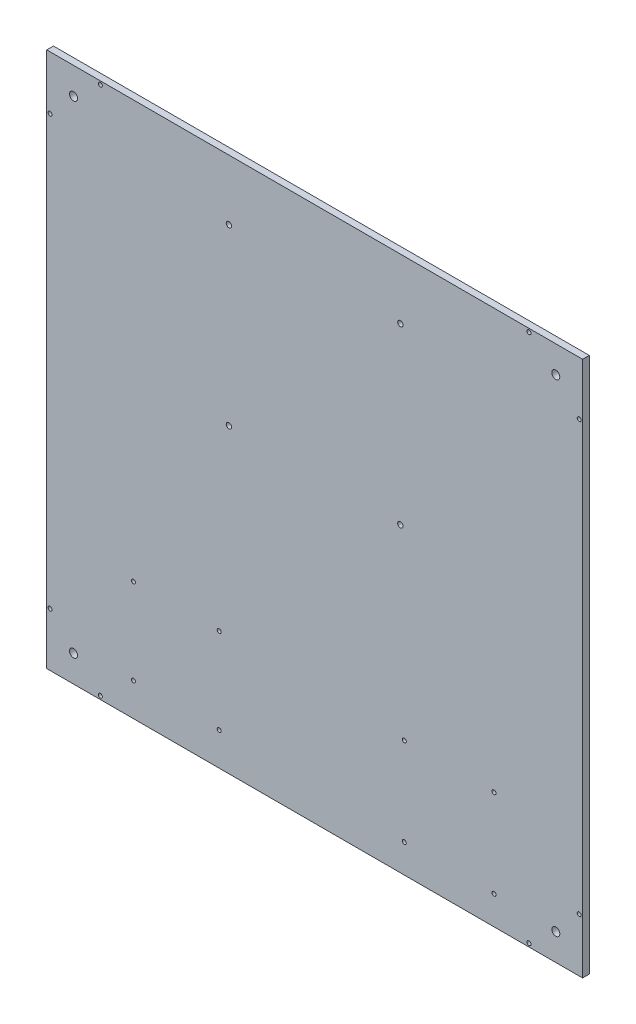
ISO-10303-21;
HEADER;
FILE_DESCRIPTION(('STEP AP214'),'2;1');
FILE_NAME('part.step','',(''),(''),'','','');
FILE_SCHEMA(('AUTOMOTIVE_DESIGN { 1 0 10303 214 1 1 1 1 }'));
ENDSEC;
DATA;
#1=APPLICATION_CONTEXT('core data for automotive mechanical design processes');
#2=APPLICATION_PROTOCOL_DEFINITION('international standard','automotive_design',2000,#1);
#3=PRODUCT_CONTEXT('',#1,'mechanical');
#4=PRODUCT('Part','Part','',(#3));
#5=PRODUCT_RELATED_PRODUCT_CATEGORY('part','',(#4));
#6=PRODUCT_DEFINITION_FORMATION('','',#4);
#7=PRODUCT_DEFINITION_CONTEXT('part definition',#1,'design');
#8=PRODUCT_DEFINITION('design','',#6,#7);
#9=PRODUCT_DEFINITION_SHAPE('','',#8);
#10=(LENGTH_UNIT() NAMED_UNIT(*) SI_UNIT(.MILLI.,.METRE.));
#11=(NAMED_UNIT(*) PLANE_ANGLE_UNIT() SI_UNIT($,.RADIAN.));
#12=(NAMED_UNIT(*) SI_UNIT($,.STERADIAN.) SOLID_ANGLE_UNIT());
#13=UNCERTAINTY_MEASURE_WITH_UNIT(LENGTH_MEASURE(1.E-05),#10,'distance_accuracy_value','');
#14=(GEOMETRIC_REPRESENTATION_CONTEXT(3) GLOBAL_UNCERTAINTY_ASSIGNED_CONTEXT((#13)) GLOBAL_UNIT_ASSIGNED_CONTEXT((#10,
#11,#12)) REPRESENTATION_CONTEXT('',''));
#15=CARTESIAN_POINT('',(0.,0.,0.));
#16=DIRECTION('',(0.,0.,1.));
#17=DIRECTION('',(1.,0.,0.));
#18=AXIS2_PLACEMENT_3D('',#15,#16,#17);
#19=CARTESIAN_POINT('',(0.,0.,5.));
#20=DIRECTION('',(0.,1.,0.));
#21=DIRECTION('',(0.,0.,1.));
#22=AXIS2_PLACEMENT_3D('',#19,#20,#21);
#23=PLANE('',#22);
#24=DIRECTION('',(1.,0.,0.));
#25=VECTOR('',#24,1.);
#26=CARTESIAN_POINT('',(0.,0.,0.));
#27=LINE('',#26,#25);
#28=CARTESIAN_POINT('',(0.,0.,0.));
#29=VERTEX_POINT('',#28);
#30=CARTESIAN_POINT('',(400.,0.,0.));
#31=VERTEX_POINT('',#30);
#32=EDGE_CURVE('E176',#29,#31,#27,.T.);
#33=ORIENTED_EDGE('',*,*,#32,.T.);
#34=DIRECTION('',(0.,0.,-1.));
#35=VECTOR('',#34,1.);
#36=CARTESIAN_POINT('',(400.,0.,5.));
#37=LINE('',#36,#35);
#38=CARTESIAN_POINT('',(400.,0.,5.));
#39=VERTEX_POINT('',#38);
#40=EDGE_CURVE('E11',#39,#31,#37,.T.);
#41=ORIENTED_EDGE('',*,*,#40,.F.);
#42=DIRECTION('',(1.,0.,0.));
#43=VECTOR('',#42,1.);
#44=CARTESIAN_POINT('',(0.,0.,5.));
#45=LINE('',#44,#43);
#46=CARTESIAN_POINT('',(0.,0.,5.));
#47=VERTEX_POINT('',#46);
#48=EDGE_CURVE('E90',#47,#39,#45,.T.);
#49=ORIENTED_EDGE('',*,*,#48,.F.);
#50=DIRECTION('',(0.,0.,-1.));
#51=VECTOR('',#50,1.);
#52=CARTESIAN_POINT('',(0.,0.,5.));
#53=LINE('',#52,#51);
#54=EDGE_CURVE('E56',#47,#29,#53,.T.);
#55=ORIENTED_EDGE('',*,*,#54,.T.);
#56=EDGE_LOOP('',(#33,#41,#49,#55));
#57=FACE_BOUND('',#56,.T.);
#58=ADVANCED_FACE('F39',(#57),#23,.F.);
#59=CARTESIAN_POINT('',(400.,0.,5.));
#60=DIRECTION('',(-1.,0.,0.));
#61=DIRECTION('',(0.,0.,1.));
#62=AXIS2_PLACEMENT_3D('',#59,#60,#61);
#63=PLANE('',#62);
#64=DIRECTION('',(0.,1.,0.));
#65=VECTOR('',#64,1.);
#66=CARTESIAN_POINT('',(400.,0.,0.));
#67=LINE('',#66,#65);
#68=CARTESIAN_POINT('',(400.,400.,0.));
#69=VERTEX_POINT('',#68);
#70=EDGE_CURVE('E95',#31,#69,#67,.T.);
#71=ORIENTED_EDGE('',*,*,#70,.T.);
#72=DIRECTION('',(0.,0.,-1.));
#73=VECTOR('',#72,1.);
#74=CARTESIAN_POINT('',(400.,400.,5.));
#75=LINE('',#74,#73);
#76=CARTESIAN_POINT('',(400.,400.,5.));
#77=VERTEX_POINT('',#76);
#78=EDGE_CURVE('E48',#77,#69,#75,.T.);
#79=ORIENTED_EDGE('',*,*,#78,.F.);
#80=DIRECTION('',(0.,1.,0.));
#81=VECTOR('',#80,1.);
#82=CARTESIAN_POINT('',(400.,0.,5.));
#83=LINE('',#82,#81);
#84=EDGE_CURVE('E81',#39,#77,#83,.T.);
#85=ORIENTED_EDGE('',*,*,#84,.F.);
#86=ORIENTED_EDGE('',*,*,#40,.T.);
#87=EDGE_LOOP('',(#71,#79,#85,#86));
#88=FACE_BOUND('',#87,.T.);
#89=ADVANCED_FACE('F94',(#88),#63,.F.);
#90=CARTESIAN_POINT('',(0.,400.,5.));
#91=DIRECTION('',(0.,1.,0.));
#92=DIRECTION('',(0.,0.,1.));
#93=AXIS2_PLACEMENT_3D('',#90,#91,#92);
#94=PLANE('',#93);
#95=DIRECTION('',(1.,0.,0.));
#96=VECTOR('',#95,1.);
#97=CARTESIAN_POINT('',(0.,400.,0.));
#98=LINE('',#97,#96);
#99=CARTESIAN_POINT('',(0.,400.,0.));
#100=VERTEX_POINT('',#99);
#101=EDGE_CURVE('E179',#100,#69,#98,.T.);
#102=ORIENTED_EDGE('',*,*,#101,.F.);
#103=DIRECTION('',(0.,0.,-1.));
#104=VECTOR('',#103,1.);
#105=CARTESIAN_POINT('',(0.,400.,5.));
#106=LINE('',#105,#104);
#107=CARTESIAN_POINT('',(0.,400.,5.));
#108=VERTEX_POINT('',#107);
#109=EDGE_CURVE('E70',#108,#100,#106,.T.);
#110=ORIENTED_EDGE('',*,*,#109,.F.);
#111=DIRECTION('',(1.,0.,0.));
#112=VECTOR('',#111,1.);
#113=CARTESIAN_POINT('',(0.,400.,5.));
#114=LINE('',#113,#112);
#115=EDGE_CURVE('E89',#108,#77,#114,.T.);
#116=ORIENTED_EDGE('',*,*,#115,.T.);
#117=ORIENTED_EDGE('',*,*,#78,.T.);
#118=EDGE_LOOP('',(#102,#110,#116,#117));
#119=FACE_BOUND('',#118,.T.);
#120=ADVANCED_FACE('F98',(#119),#94,.T.);
#121=CARTESIAN_POINT('',(136.,225.,5.));
#122=DIRECTION('',(0.,0.,-1.));
#123=DIRECTION('',(-1.,0.,0.));
#124=AXIS2_PLACEMENT_3D('',#121,#122,#123);
#125=CYLINDRICAL_SURFACE('',#124,2.);
#126=CARTESIAN_POINT('',(136.,225.,5.));
#127=DIRECTION('',(0.,0.,1.));
#128=DIRECTION('',(1.,0.,0.));
#129=AXIS2_PLACEMENT_3D('',#126,#127,#128);
#130=CIRCLE('',#129,2.);
#131=CARTESIAN_POINT('',(138.,225.,5.));
#132=VERTEX_POINT('',#131);
#133=EDGE_CURVE('E110',#132,#132,#130,.T.);
#134=ORIENTED_EDGE('',*,*,#133,.T.);
#135=EDGE_LOOP('',(#134));
#136=FACE_BOUND('',#135,.T.);
#137=CARTESIAN_POINT('',(136.,225.,0.));
#138=DIRECTION('',(0.,0.,1.));
#139=DIRECTION('',(1.,0.,0.));
#140=AXIS2_PLACEMENT_3D('',#137,#138,#139);
#141=CIRCLE('',#140,2.);
#142=CARTESIAN_POINT('',(138.,225.,0.));
#143=VERTEX_POINT('',#142);
#144=EDGE_CURVE('E190',#143,#143,#141,.T.);
#145=ORIENTED_EDGE('',*,*,#144,.F.);
#146=EDGE_LOOP('',(#145));
#147=FACE_BOUND('',#146,.T.);
#148=ADVANCED_FACE('F412',(#136,#147),#125,.F.);
#149=CARTESIAN_POINT('',(264.,225.,5.));
#150=DIRECTION('',(0.,0.,-1.));
#151=DIRECTION('',(-1.,0.,0.));
#152=AXIS2_PLACEMENT_3D('',#149,#150,#151);
#153=CYLINDRICAL_SURFACE('',#152,2.);
#154=CARTESIAN_POINT('',(264.,225.,5.));
#155=DIRECTION('',(0.,0.,1.));
#156=DIRECTION('',(1.,0.,0.));
#157=AXIS2_PLACEMENT_3D('',#154,#155,#156);
#158=CIRCLE('',#157,2.);
#159=CARTESIAN_POINT('',(266.,225.,5.));
#160=VERTEX_POINT('',#159);
#161=EDGE_CURVE('E107',#160,#160,#158,.T.);
#162=ORIENTED_EDGE('',*,*,#161,.T.);
#163=EDGE_LOOP('',(#162));
#164=FACE_BOUND('',#163,.T.);
#165=CARTESIAN_POINT('',(264.,225.,0.));
#166=DIRECTION('',(0.,0.,1.));
#167=DIRECTION('',(1.,0.,0.));
#168=AXIS2_PLACEMENT_3D('',#165,#166,#167);
#169=CIRCLE('',#168,2.);
#170=CARTESIAN_POINT('',(266.,225.,0.));
#171=VERTEX_POINT('',#170);
#172=EDGE_CURVE('E187',#171,#171,#169,.T.);
#173=ORIENTED_EDGE('',*,*,#172,.F.);
#174=EDGE_LOOP('',(#173));
#175=FACE_BOUND('',#174,.T.);
#176=ADVANCED_FACE('F414',(#164,#175),#153,.F.);
#177=CARTESIAN_POINT('',(264.,355.,5.));
#178=DIRECTION('',(0.,0.,-1.));
#179=DIRECTION('',(-1.,0.,0.));
#180=AXIS2_PLACEMENT_3D('',#177,#178,#179);
#181=CYLINDRICAL_SURFACE('',#180,2.);
#182=CARTESIAN_POINT('',(264.,355.,5.));
#183=DIRECTION('',(0.,0.,1.));
#184=DIRECTION('',(1.,0.,0.));
#185=AXIS2_PLACEMENT_3D('',#182,#183,#184);
#186=CIRCLE('',#185,2.);
#187=CARTESIAN_POINT('',(266.,355.,5.));
#188=VERTEX_POINT('',#187);
#189=EDGE_CURVE('E101',#188,#188,#186,.T.);
#190=ORIENTED_EDGE('',*,*,#189,.T.);
#191=EDGE_LOOP('',(#190));
#192=FACE_BOUND('',#191,.T.);
#193=CARTESIAN_POINT('',(264.,355.,0.));
#194=DIRECTION('',(0.,0.,1.));
#195=DIRECTION('',(1.,0.,0.));
#196=AXIS2_PLACEMENT_3D('',#193,#194,#195);
#197=CIRCLE('',#196,2.);
#198=CARTESIAN_POINT('',(266.,355.,0.));
#199=VERTEX_POINT('',#198);
#200=EDGE_CURVE('E184',#199,#199,#197,.T.);
#201=ORIENTED_EDGE('',*,*,#200,.F.);
#202=EDGE_LOOP('',(#201));
#203=FACE_BOUND('',#202,.T.);
#204=ADVANCED_FACE('F421',(#192,#203),#181,.F.);
#205=CARTESIAN_POINT('',(0.,0.,5.));
#206=DIRECTION('',(-1.,0.,0.));
#207=DIRECTION('',(0.,0.,1.));
#208=AXIS2_PLACEMENT_3D('',#205,#206,#207);
#209=PLANE('',#208);
#210=DIRECTION('',(0.,1.,0.));
#211=VECTOR('',#210,1.);
#212=CARTESIAN_POINT('',(0.,0.,0.));
#213=LINE('',#212,#211);
#214=EDGE_CURVE('E181',#29,#100,#213,.T.);
#215=ORIENTED_EDGE('',*,*,#214,.F.);
#216=ORIENTED_EDGE('',*,*,#54,.F.);
#217=DIRECTION('',(0.,1.,0.));
#218=VECTOR('',#217,1.);
#219=CARTESIAN_POINT('',(0.,0.,5.));
#220=LINE('',#219,#218);
#221=EDGE_CURVE('E99',#47,#108,#220,.T.);
#222=ORIENTED_EDGE('',*,*,#221,.T.);
#223=ORIENTED_EDGE('',*,*,#109,.T.);
#224=EDGE_LOOP('',(#215,#216,#222,#223));
#225=FACE_BOUND('',#224,.T.);
#226=ADVANCED_FACE('F291',(#225),#209,.T.);
#227=CARTESIAN_POINT('',(20.,380.,5.));
#228=DIRECTION('',(0.,0.,-1.));
#229=DIRECTION('',(-1.,0.,0.));
#230=AXIS2_PLACEMENT_3D('',#227,#228,#229);
#231=CYLINDRICAL_SURFACE('',#230,3.);
#232=CARTESIAN_POINT('',(20.,380.,5.));
#233=DIRECTION('',(0.,0.,1.));
#234=DIRECTION('',(1.,0.,0.));
#235=AXIS2_PLACEMENT_3D('',#232,#233,#234);
#236=CIRCLE('',#235,3.);
#237=CARTESIAN_POINT('',(23.,380.,5.));
#238=VERTEX_POINT('',#237);
#239=EDGE_CURVE('E259',#238,#238,#236,.T.);
#240=ORIENTED_EDGE('',*,*,#239,.T.);
#241=EDGE_LOOP('',(#240));
#242=FACE_BOUND('',#241,.T.);
#243=CARTESIAN_POINT('',(20.,380.,0.));
#244=DIRECTION('',(0.,0.,1.));
#245=DIRECTION('',(1.,0.,0.));
#246=AXIS2_PLACEMENT_3D('',#243,#244,#245);
#247=CIRCLE('',#246,3.);
#248=CARTESIAN_POINT('',(23.,380.,0.));
#249=VERTEX_POINT('',#248);
#250=EDGE_CURVE('E173',#249,#249,#247,.T.);
#251=ORIENTED_EDGE('',*,*,#250,.F.);
#252=EDGE_LOOP('',(#251));
#253=FACE_BOUND('',#252,.T.);
#254=ADVANCED_FACE('F263',(#242,#253),#231,.F.);
#255=CARTESIAN_POINT('',(20.,20.,5.));
#256=DIRECTION('',(0.,0.,-1.));
#257=DIRECTION('',(-1.,0.,0.));
#258=AXIS2_PLACEMENT_3D('',#255,#256,#257);
#259=CYLINDRICAL_SURFACE('',#258,3.);
#260=CARTESIAN_POINT('',(20.,20.,5.));
#261=DIRECTION('',(0.,0.,1.));
#262=DIRECTION('',(1.,0.,0.));
#263=AXIS2_PLACEMENT_3D('',#260,#261,#262);
#264=CIRCLE('',#263,3.);
#265=CARTESIAN_POINT('',(23.,20.,5.));
#266=VERTEX_POINT('',#265);
#267=EDGE_CURVE('E256',#266,#266,#264,.T.);
#268=ORIENTED_EDGE('',*,*,#267,.T.);
#269=EDGE_LOOP('',(#268));
#270=FACE_BOUND('',#269,.T.);
#271=CARTESIAN_POINT('',(20.,20.,0.));
#272=DIRECTION('',(0.,0.,1.));
#273=DIRECTION('',(1.,0.,0.));
#274=AXIS2_PLACEMENT_3D('',#271,#272,#273);
#275=CIRCLE('',#274,3.);
#276=CARTESIAN_POINT('',(23.,20.,0.));
#277=VERTEX_POINT('',#276);
#278=EDGE_CURVE('E170',#277,#277,#275,.T.);
#279=ORIENTED_EDGE('',*,*,#278,.F.);
#280=EDGE_LOOP('',(#279));
#281=FACE_BOUND('',#280,.T.);
#282=ADVANCED_FACE('F290',(#270,#281),#259,.F.);
#283=CARTESIAN_POINT('',(380.,20.,5.));
#284=DIRECTION('',(0.,0.,-1.));
#285=DIRECTION('',(-1.,0.,0.));
#286=AXIS2_PLACEMENT_3D('',#283,#284,#285);
#287=CYLINDRICAL_SURFACE('',#286,2.99999999999999);
#288=CARTESIAN_POINT('',(380.,20.,5.));
#289=DIRECTION('',(0.,0.,1.));
#290=DIRECTION('',(1.,0.,0.));
#291=AXIS2_PLACEMENT_3D('',#288,#289,#290);
#292=CIRCLE('',#291,2.99999999999999);
#293=CARTESIAN_POINT('',(383.,20.,5.));
#294=VERTEX_POINT('',#293);
#295=EDGE_CURVE('E253',#294,#294,#292,.T.);
#296=ORIENTED_EDGE('',*,*,#295,.T.);
#297=EDGE_LOOP('',(#296));
#298=FACE_BOUND('',#297,.T.);
#299=CARTESIAN_POINT('',(380.,20.,0.));
#300=DIRECTION('',(0.,0.,1.));
#301=DIRECTION('',(1.,0.,0.));
#302=AXIS2_PLACEMENT_3D('',#299,#300,#301);
#303=CIRCLE('',#302,2.99999999999999);
#304=CARTESIAN_POINT('',(383.,20.,0.));
#305=VERTEX_POINT('',#304);
#306=EDGE_CURVE('E167',#305,#305,#303,.T.);
#307=ORIENTED_EDGE('',*,*,#306,.F.);
#308=EDGE_LOOP('',(#307));
#309=FACE_BOUND('',#308,.T.);
#310=ADVANCED_FACE('F294',(#298,#309),#287,.F.);
#311=CARTESIAN_POINT('',(380.,380.,5.));
#312=DIRECTION('',(0.,0.,-1.));
#313=DIRECTION('',(-1.,0.,0.));
#314=AXIS2_PLACEMENT_3D('',#311,#312,#313);
#315=CYLINDRICAL_SURFACE('',#314,2.99999999999999);
#316=CARTESIAN_POINT('',(380.,380.,5.));
#317=DIRECTION('',(0.,0.,1.));
#318=DIRECTION('',(1.,0.,0.));
#319=AXIS2_PLACEMENT_3D('',#316,#317,#318);
#320=CIRCLE('',#319,2.99999999999999);
#321=CARTESIAN_POINT('',(383.,380.,5.));
#322=VERTEX_POINT('',#321);
#323=EDGE_CURVE('E250',#322,#322,#320,.T.);
#324=ORIENTED_EDGE('',*,*,#323,.T.);
#325=EDGE_LOOP('',(#324));
#326=FACE_BOUND('',#325,.T.);
#327=CARTESIAN_POINT('',(380.,380.,0.));
#328=DIRECTION('',(0.,0.,1.));
#329=DIRECTION('',(1.,0.,0.));
#330=AXIS2_PLACEMENT_3D('',#327,#328,#329);
#331=CIRCLE('',#330,2.99999999999999);
#332=CARTESIAN_POINT('',(383.,380.,0.));
#333=VERTEX_POINT('',#332);
#334=EDGE_CURVE('E164',#333,#333,#331,.T.);
#335=ORIENTED_EDGE('',*,*,#334,.F.);
#336=EDGE_LOOP('',(#335));
#337=FACE_BOUND('',#336,.T.);
#338=ADVANCED_FACE('F298',(#326,#337),#315,.F.);
#339=CARTESIAN_POINT('',(40.,2.5,5.));
#340=DIRECTION('',(0.,0.,-1.));
#341=DIRECTION('',(-1.,0.,0.));
#342=AXIS2_PLACEMENT_3D('',#339,#340,#341);
#343=CYLINDRICAL_SURFACE('',#342,1.5);
#344=CARTESIAN_POINT('',(40.,2.5,5.));
#345=DIRECTION('',(0.,0.,1.));
#346=DIRECTION('',(1.,0.,0.));
#347=AXIS2_PLACEMENT_3D('',#344,#345,#346);
#348=CIRCLE('',#347,1.5);
#349=CARTESIAN_POINT('',(41.5,2.5,5.));
#350=VERTEX_POINT('',#349);
#351=EDGE_CURVE('E247',#350,#350,#348,.T.);
#352=ORIENTED_EDGE('',*,*,#351,.T.);
#353=EDGE_LOOP('',(#352));
#354=FACE_BOUND('',#353,.T.);
#355=CARTESIAN_POINT('',(40.,2.5,0.));
#356=DIRECTION('',(0.,0.,1.));
#357=DIRECTION('',(1.,0.,0.));
#358=AXIS2_PLACEMENT_3D('',#355,#356,#357);
#359=CIRCLE('',#358,1.5);
#360=CARTESIAN_POINT('',(41.5,2.5,0.));
#361=VERTEX_POINT('',#360);
#362=EDGE_CURVE('E161',#361,#361,#359,.T.);
#363=ORIENTED_EDGE('',*,*,#362,.F.);
#364=EDGE_LOOP('',(#363));
#365=FACE_BOUND('',#364,.T.);
#366=ADVANCED_FACE('F302',(#354,#365),#343,.F.);
#367=CARTESIAN_POINT('',(2.5,40.,5.));
#368=DIRECTION('',(0.,0.,-1.));
#369=DIRECTION('',(-1.,0.,0.));
#370=AXIS2_PLACEMENT_3D('',#367,#368,#369);
#371=CYLINDRICAL_SURFACE('',#370,1.5);
#372=CARTESIAN_POINT('',(2.5,40.,5.));
#373=DIRECTION('',(0.,0.,1.));
#374=DIRECTION('',(1.,0.,0.));
#375=AXIS2_PLACEMENT_3D('',#372,#373,#374);
#376=CIRCLE('',#375,1.5);
#377=CARTESIAN_POINT('',(4.,40.,5.));
#378=VERTEX_POINT('',#377);
#379=EDGE_CURVE('E244',#378,#378,#376,.T.);
#380=ORIENTED_EDGE('',*,*,#379,.T.);
#381=EDGE_LOOP('',(#380));
#382=FACE_BOUND('',#381,.T.);
#383=CARTESIAN_POINT('',(2.5,40.,0.));
#384=DIRECTION('',(0.,0.,1.));
#385=DIRECTION('',(1.,0.,0.));
#386=AXIS2_PLACEMENT_3D('',#383,#384,#385);
#387=CIRCLE('',#386,1.5);
#388=CARTESIAN_POINT('',(4.,40.,0.));
#389=VERTEX_POINT('',#388);
#390=EDGE_CURVE('E158',#389,#389,#387,.T.);
#391=ORIENTED_EDGE('',*,*,#390,.F.);
#392=EDGE_LOOP('',(#391));
#393=FACE_BOUND('',#392,.T.);
#394=ADVANCED_FACE('F306',(#382,#393),#371,.F.);
#395=CARTESIAN_POINT('',(2.5,360.,5.));
#396=DIRECTION('',(0.,0.,-1.));
#397=DIRECTION('',(-1.,0.,0.));
#398=AXIS2_PLACEMENT_3D('',#395,#396,#397);
#399=CYLINDRICAL_SURFACE('',#398,1.5);
#400=CARTESIAN_POINT('',(2.5,360.,5.));
#401=DIRECTION('',(0.,0.,1.));
#402=DIRECTION('',(1.,0.,0.));
#403=AXIS2_PLACEMENT_3D('',#400,#401,#402);
#404=CIRCLE('',#403,1.5);
#405=CARTESIAN_POINT('',(4.,360.,5.));
#406=VERTEX_POINT('',#405);
#407=EDGE_CURVE('E241',#406,#406,#404,.T.);
#408=ORIENTED_EDGE('',*,*,#407,.T.);
#409=EDGE_LOOP('',(#408));
#410=FACE_BOUND('',#409,.T.);
#411=CARTESIAN_POINT('',(2.5,360.,0.));
#412=DIRECTION('',(0.,0.,1.));
#413=DIRECTION('',(1.,0.,0.));
#414=AXIS2_PLACEMENT_3D('',#411,#412,#413);
#415=CIRCLE('',#414,1.5);
#416=CARTESIAN_POINT('',(4.,360.,0.));
#417=VERTEX_POINT('',#416);
#418=EDGE_CURVE('E155',#417,#417,#415,.T.);
#419=ORIENTED_EDGE('',*,*,#418,.F.);
#420=EDGE_LOOP('',(#419));
#421=FACE_BOUND('',#420,.T.);
#422=ADVANCED_FACE('F310',(#410,#421),#399,.F.);
#423=CARTESIAN_POINT('',(397.5,360.,5.));
#424=DIRECTION('',(0.,0.,-1.));
#425=DIRECTION('',(-1.,0.,0.));
#426=AXIS2_PLACEMENT_3D('',#423,#424,#425);
#427=CYLINDRICAL_SURFACE('',#426,1.50000000000002);
#428=CARTESIAN_POINT('',(397.5,360.,5.));
#429=DIRECTION('',(0.,0.,1.));
#430=DIRECTION('',(1.,0.,0.));
#431=AXIS2_PLACEMENT_3D('',#428,#429,#430);
#432=CIRCLE('',#431,1.50000000000002);
#433=CARTESIAN_POINT('',(399.,360.,5.));
#434=VERTEX_POINT('',#433);
#435=EDGE_CURVE('E238',#434,#434,#432,.T.);
#436=ORIENTED_EDGE('',*,*,#435,.T.);
#437=EDGE_LOOP('',(#436));
#438=FACE_BOUND('',#437,.T.);
#439=CARTESIAN_POINT('',(397.5,360.,0.));
#440=DIRECTION('',(0.,0.,1.));
#441=DIRECTION('',(1.,0.,0.));
#442=AXIS2_PLACEMENT_3D('',#439,#440,#441);
#443=CIRCLE('',#442,1.50000000000002);
#444=CARTESIAN_POINT('',(399.,360.,0.));
#445=VERTEX_POINT('',#444);
#446=EDGE_CURVE('E152',#445,#445,#443,.T.);
#447=ORIENTED_EDGE('',*,*,#446,.F.);
#448=EDGE_LOOP('',(#447));
#449=FACE_BOUND('',#448,.T.);
#450=ADVANCED_FACE('F314',(#438,#449),#427,.F.);
#451=CARTESIAN_POINT('',(360.,2.5,5.));
#452=DIRECTION('',(0.,0.,-1.));
#453=DIRECTION('',(-1.,0.,0.));
#454=AXIS2_PLACEMENT_3D('',#451,#452,#453);
#455=CYLINDRICAL_SURFACE('',#454,1.50000000000002);
#456=CARTESIAN_POINT('',(360.,2.5,5.));
#457=DIRECTION('',(0.,0.,1.));
#458=DIRECTION('',(1.,0.,0.));
#459=AXIS2_PLACEMENT_3D('',#456,#457,#458);
#460=CIRCLE('',#459,1.50000000000002);
#461=CARTESIAN_POINT('',(361.5,2.5,5.));
#462=VERTEX_POINT('',#461);
#463=EDGE_CURVE('E235',#462,#462,#460,.T.);
#464=ORIENTED_EDGE('',*,*,#463,.T.);
#465=EDGE_LOOP('',(#464));
#466=FACE_BOUND('',#465,.T.);
#467=CARTESIAN_POINT('',(360.,2.5,0.));
#468=DIRECTION('',(0.,0.,1.));
#469=DIRECTION('',(1.,0.,0.));
#470=AXIS2_PLACEMENT_3D('',#467,#468,#469);
#471=CIRCLE('',#470,1.50000000000002);
#472=CARTESIAN_POINT('',(361.5,2.5,0.));
#473=VERTEX_POINT('',#472);
#474=EDGE_CURVE('E149',#473,#473,#471,.T.);
#475=ORIENTED_EDGE('',*,*,#474,.F.);
#476=EDGE_LOOP('',(#475));
#477=FACE_BOUND('',#476,.T.);
#478=ADVANCED_FACE('F318',(#466,#477),#455,.F.);
#479=CARTESIAN_POINT('',(40.,397.5,5.));
#480=DIRECTION('',(0.,0.,-1.));
#481=DIRECTION('',(-1.,0.,0.));
#482=AXIS2_PLACEMENT_3D('',#479,#480,#481);
#483=CYLINDRICAL_SURFACE('',#482,1.5);
#484=CARTESIAN_POINT('',(40.,397.5,5.));
#485=DIRECTION('',(0.,0.,1.));
#486=DIRECTION('',(1.,0.,0.));
#487=AXIS2_PLACEMENT_3D('',#484,#485,#486);
#488=CIRCLE('',#487,1.5);
#489=CARTESIAN_POINT('',(41.5,397.5,5.));
#490=VERTEX_POINT('',#489);
#491=EDGE_CURVE('E232',#490,#490,#488,.T.);
#492=ORIENTED_EDGE('',*,*,#491,.T.);
#493=EDGE_LOOP('',(#492));
#494=FACE_BOUND('',#493,.T.);
#495=CARTESIAN_POINT('',(40.,397.5,0.));
#496=DIRECTION('',(0.,0.,1.));
#497=DIRECTION('',(1.,0.,0.));
#498=AXIS2_PLACEMENT_3D('',#495,#496,#497);
#499=CIRCLE('',#498,1.5);
#500=CARTESIAN_POINT('',(41.5,397.5,0.));
#501=VERTEX_POINT('',#500);
#502=EDGE_CURVE('E146',#501,#501,#499,.T.);
#503=ORIENTED_EDGE('',*,*,#502,.F.);
#504=EDGE_LOOP('',(#503));
#505=FACE_BOUND('',#504,.T.);
#506=ADVANCED_FACE('F322',(#494,#505),#483,.F.);
#507=CARTESIAN_POINT('',(360.,397.5,5.));
#508=DIRECTION('',(0.,0.,-1.));
#509=DIRECTION('',(-1.,0.,0.));
#510=AXIS2_PLACEMENT_3D('',#507,#508,#509);
#511=CYLINDRICAL_SURFACE('',#510,1.50000000000002);
#512=CARTESIAN_POINT('',(360.,397.5,5.));
#513=DIRECTION('',(0.,0.,1.));
#514=DIRECTION('',(1.,0.,0.));
#515=AXIS2_PLACEMENT_3D('',#512,#513,#514);
#516=CIRCLE('',#515,1.50000000000002);
#517=CARTESIAN_POINT('',(361.5,397.5,5.));
#518=VERTEX_POINT('',#517);
#519=EDGE_CURVE('E229',#518,#518,#516,.T.);
#520=ORIENTED_EDGE('',*,*,#519,.T.);
#521=EDGE_LOOP('',(#520));
#522=FACE_BOUND('',#521,.T.);
#523=CARTESIAN_POINT('',(360.,397.5,0.));
#524=DIRECTION('',(0.,0.,1.));
#525=DIRECTION('',(1.,0.,0.));
#526=AXIS2_PLACEMENT_3D('',#523,#524,#525);
#527=CIRCLE('',#526,1.50000000000002);
#528=CARTESIAN_POINT('',(361.5,397.5,0.));
#529=VERTEX_POINT('',#528);
#530=EDGE_CURVE('E143',#529,#529,#527,.T.);
#531=ORIENTED_EDGE('',*,*,#530,.F.);
#532=EDGE_LOOP('',(#531));
#533=FACE_BOUND('',#532,.T.);
#534=ADVANCED_FACE('F326',(#522,#533),#511,.F.);
#535=CARTESIAN_POINT('',(397.5,40.,5.));
#536=DIRECTION('',(0.,0.,-1.));
#537=DIRECTION('',(-1.,0.,0.));
#538=AXIS2_PLACEMENT_3D('',#535,#536,#537);
#539=CYLINDRICAL_SURFACE('',#538,1.50000000000002);
#540=CARTESIAN_POINT('',(397.5,40.,5.));
#541=DIRECTION('',(0.,0.,1.));
#542=DIRECTION('',(1.,0.,0.));
#543=AXIS2_PLACEMENT_3D('',#540,#541,#542);
#544=CIRCLE('',#543,1.50000000000002);
#545=CARTESIAN_POINT('',(399.,40.,5.));
#546=VERTEX_POINT('',#545);
#547=EDGE_CURVE('E226',#546,#546,#544,.T.);
#548=ORIENTED_EDGE('',*,*,#547,.T.);
#549=EDGE_LOOP('',(#548));
#550=FACE_BOUND('',#549,.T.);
#551=CARTESIAN_POINT('',(397.5,40.,0.));
#552=DIRECTION('',(0.,0.,1.));
#553=DIRECTION('',(1.,0.,0.));
#554=AXIS2_PLACEMENT_3D('',#551,#552,#553);
#555=CIRCLE('',#554,1.50000000000002);
#556=CARTESIAN_POINT('',(399.,40.,0.));
#557=VERTEX_POINT('',#556);
#558=EDGE_CURVE('E140',#557,#557,#555,.T.);
#559=ORIENTED_EDGE('',*,*,#558,.F.);
#560=EDGE_LOOP('',(#559));
#561=FACE_BOUND('',#560,.T.);
#562=ADVANCED_FACE('F330',(#550,#561),#539,.F.);
#563=CARTESIAN_POINT('',(333.89,21.385,5.));
#564=DIRECTION('',(0.,0.,-1.));
#565=DIRECTION('',(-1.,0.,0.));
#566=AXIS2_PLACEMENT_3D('',#563,#564,#565);
#567=CYLINDRICAL_SURFACE('',#566,1.50000000000002);
#568=CARTESIAN_POINT('',(333.89,21.385,5.));
#569=DIRECTION('',(0.,0.,1.));
#570=DIRECTION('',(1.,0.,0.));
#571=AXIS2_PLACEMENT_3D('',#568,#569,#570);
#572=CIRCLE('',#571,1.50000000000002);
#573=CARTESIAN_POINT('',(335.39,21.385,5.));
#574=VERTEX_POINT('',#573);
#575=EDGE_CURVE('E223',#574,#574,#572,.T.);
#576=ORIENTED_EDGE('',*,*,#575,.T.);
#577=EDGE_LOOP('',(#576));
#578=FACE_BOUND('',#577,.T.);
#579=CARTESIAN_POINT('',(333.89,21.385,0.));
#580=DIRECTION('',(0.,0.,1.));
#581=DIRECTION('',(1.,0.,0.));
#582=AXIS2_PLACEMENT_3D('',#579,#580,#581);
#583=CIRCLE('',#582,1.50000000000002);
#584=CARTESIAN_POINT('',(335.39,21.385,0.));
#585=VERTEX_POINT('',#584);
#586=EDGE_CURVE('E137',#585,#585,#583,.T.);
#587=ORIENTED_EDGE('',*,*,#586,.F.);
#588=EDGE_LOOP('',(#587));
#589=FACE_BOUND('',#588,.T.);
#590=ADVANCED_FACE('F334',(#578,#589),#567,.F.);
#591=CARTESIAN_POINT('',(266.89,21.385,5.));
#592=DIRECTION('',(0.,0.,-1.));
#593=DIRECTION('',(-1.,0.,0.));
#594=AXIS2_PLACEMENT_3D('',#591,#592,#593);
#595=CYLINDRICAL_SURFACE('',#594,1.50000000000002);
#596=CARTESIAN_POINT('',(266.89,21.385,5.));
#597=DIRECTION('',(0.,0.,1.));
#598=DIRECTION('',(1.,0.,0.));
#599=AXIS2_PLACEMENT_3D('',#596,#597,#598);
#600=CIRCLE('',#599,1.50000000000002);
#601=CARTESIAN_POINT('',(268.39,21.385,5.));
#602=VERTEX_POINT('',#601);
#603=EDGE_CURVE('E220',#602,#602,#600,.T.);
#604=ORIENTED_EDGE('',*,*,#603,.T.);
#605=EDGE_LOOP('',(#604));
#606=FACE_BOUND('',#605,.T.);
#607=CARTESIAN_POINT('',(266.89,21.385,0.));
#608=DIRECTION('',(0.,0.,1.));
#609=DIRECTION('',(1.,0.,0.));
#610=AXIS2_PLACEMENT_3D('',#607,#608,#609);
#611=CIRCLE('',#610,1.50000000000002);
#612=CARTESIAN_POINT('',(268.39,21.385,0.));
#613=VERTEX_POINT('',#612);
#614=EDGE_CURVE('E134',#613,#613,#611,.T.);
#615=ORIENTED_EDGE('',*,*,#614,.F.);
#616=EDGE_LOOP('',(#615));
#617=FACE_BOUND('',#616,.T.);
#618=ADVANCED_FACE('F338',(#606,#617),#595,.F.);
#619=CARTESIAN_POINT('',(266.89,87.056,5.));
#620=DIRECTION('',(0.,0.,-1.));
#621=DIRECTION('',(-1.,0.,0.));
#622=AXIS2_PLACEMENT_3D('',#619,#620,#621);
#623=CYLINDRICAL_SURFACE('',#622,1.50000000000002);
#624=CARTESIAN_POINT('',(266.89,87.056,5.));
#625=DIRECTION('',(0.,0.,1.));
#626=DIRECTION('',(1.,0.,0.));
#627=AXIS2_PLACEMENT_3D('',#624,#625,#626);
#628=CIRCLE('',#627,1.50000000000002);
#629=CARTESIAN_POINT('',(268.39,87.056,5.));
#630=VERTEX_POINT('',#629);
#631=EDGE_CURVE('E217',#630,#630,#628,.T.);
#632=ORIENTED_EDGE('',*,*,#631,.T.);
#633=EDGE_LOOP('',(#632));
#634=FACE_BOUND('',#633,.T.);
#635=CARTESIAN_POINT('',(266.89,87.056,0.));
#636=DIRECTION('',(0.,0.,1.));
#637=DIRECTION('',(1.,0.,0.));
#638=AXIS2_PLACEMENT_3D('',#635,#636,#637);
#639=CIRCLE('',#638,1.50000000000002);
#640=CARTESIAN_POINT('',(268.39,87.056,0.));
#641=VERTEX_POINT('',#640);
#642=EDGE_CURVE('E131',#641,#641,#639,.T.);
#643=ORIENTED_EDGE('',*,*,#642,.F.);
#644=EDGE_LOOP('',(#643));
#645=FACE_BOUND('',#644,.T.);
#646=ADVANCED_FACE('F342',(#634,#645),#623,.F.);
#647=CARTESIAN_POINT('',(333.89,87.056,5.));
#648=DIRECTION('',(0.,0.,-1.));
#649=DIRECTION('',(-1.,0.,0.));
#650=AXIS2_PLACEMENT_3D('',#647,#648,#649);
#651=CYLINDRICAL_SURFACE('',#650,1.50000000000002);
#652=CARTESIAN_POINT('',(333.89,87.056,5.));
#653=DIRECTION('',(0.,0.,1.));
#654=DIRECTION('',(1.,0.,0.));
#655=AXIS2_PLACEMENT_3D('',#652,#653,#654);
#656=CIRCLE('',#655,1.50000000000002);
#657=CARTESIAN_POINT('',(335.39,87.056,5.));
#658=VERTEX_POINT('',#657);
#659=EDGE_CURVE('E214',#658,#658,#656,.T.);
#660=ORIENTED_EDGE('',*,*,#659,.T.);
#661=EDGE_LOOP('',(#660));
#662=FACE_BOUND('',#661,.T.);
#663=CARTESIAN_POINT('',(333.89,87.056,0.));
#664=DIRECTION('',(0.,0.,1.));
#665=DIRECTION('',(1.,0.,0.));
#666=AXIS2_PLACEMENT_3D('',#663,#664,#665);
#667=CIRCLE('',#666,1.50000000000002);
#668=CARTESIAN_POINT('',(335.39,87.056,0.));
#669=VERTEX_POINT('',#668);
#670=EDGE_CURVE('E128',#669,#669,#667,.T.);
#671=ORIENTED_EDGE('',*,*,#670,.F.);
#672=EDGE_LOOP('',(#671));
#673=FACE_BOUND('',#672,.T.);
#674=ADVANCED_FACE('F346',(#662,#673),#651,.F.);
#675=CARTESIAN_POINT('',(128.75,24.663,5.));
#676=DIRECTION('',(0.,0.,-1.));
#677=DIRECTION('',(-1.,0.,0.));
#678=AXIS2_PLACEMENT_3D('',#675,#676,#677);
#679=CYLINDRICAL_SURFACE('',#678,1.5);
#680=CARTESIAN_POINT('',(128.75,24.663,5.));
#681=DIRECTION('',(0.,0.,1.));
#682=DIRECTION('',(1.,0.,0.));
#683=AXIS2_PLACEMENT_3D('',#680,#681,#682);
#684=CIRCLE('',#683,1.5);
#685=CARTESIAN_POINT('',(130.25,24.663,5.));
#686=VERTEX_POINT('',#685);
#687=EDGE_CURVE('E211',#686,#686,#684,.T.);
#688=ORIENTED_EDGE('',*,*,#687,.T.);
#689=EDGE_LOOP('',(#688));
#690=FACE_BOUND('',#689,.T.);
#691=CARTESIAN_POINT('',(128.75,24.663,0.));
#692=DIRECTION('',(0.,0.,1.));
#693=DIRECTION('',(1.,0.,0.));
#694=AXIS2_PLACEMENT_3D('',#691,#692,#693);
#695=CIRCLE('',#694,1.5);
#696=CARTESIAN_POINT('',(130.25,24.663,0.));
#697=VERTEX_POINT('',#696);
#698=EDGE_CURVE('E125',#697,#697,#695,.T.);
#699=ORIENTED_EDGE('',*,*,#698,.F.);
#700=EDGE_LOOP('',(#699));
#701=FACE_BOUND('',#700,.T.);
#702=ADVANCED_FACE('F350',(#690,#701),#679,.F.);
#703=CARTESIAN_POINT('',(64.755,24.66,5.));
#704=DIRECTION('',(0.,0.,-1.));
#705=DIRECTION('',(-1.,0.,0.));
#706=AXIS2_PLACEMENT_3D('',#703,#704,#705);
#707=CYLINDRICAL_SURFACE('',#706,1.5);
#708=CARTESIAN_POINT('',(64.755,24.66,5.));
#709=DIRECTION('',(0.,0.,1.));
#710=DIRECTION('',(1.,0.,0.));
#711=AXIS2_PLACEMENT_3D('',#708,#709,#710);
#712=CIRCLE('',#711,1.5);
#713=CARTESIAN_POINT('',(66.255,24.66,5.));
#714=VERTEX_POINT('',#713);
#715=EDGE_CURVE('E206',#714,#714,#712,.T.);
#716=ORIENTED_EDGE('',*,*,#715,.T.);
#717=EDGE_LOOP('',(#716));
#718=FACE_BOUND('',#717,.T.);
#719=CARTESIAN_POINT('',(64.755,24.66,0.));
#720=DIRECTION('',(0.,0.,1.));
#721=DIRECTION('',(1.,0.,0.));
#722=AXIS2_PLACEMENT_3D('',#719,#720,#721);
#723=CIRCLE('',#722,1.5);
#724=CARTESIAN_POINT('',(66.255,24.66,0.));
#725=VERTEX_POINT('',#724);
#726=EDGE_CURVE('E122',#725,#725,#723,.T.);
#727=ORIENTED_EDGE('',*,*,#726,.F.);
#728=EDGE_LOOP('',(#727));
#729=FACE_BOUND('',#728,.T.);
#730=ADVANCED_FACE('F354',(#718,#729),#707,.F.);
#731=CARTESIAN_POINT('',(128.75,88.663,5.));
#732=DIRECTION('',(0.,0.,-1.));
#733=DIRECTION('',(-1.,0.,0.));
#734=AXIS2_PLACEMENT_3D('',#731,#732,#733);
#735=CYLINDRICAL_SURFACE('',#734,1.5);
#736=CARTESIAN_POINT('',(128.75,88.663,5.));
#737=DIRECTION('',(0.,0.,1.));
#738=DIRECTION('',(1.,0.,0.));
#739=AXIS2_PLACEMENT_3D('',#736,#737,#738);
#740=CIRCLE('',#739,1.5);
#741=CARTESIAN_POINT('',(130.25,88.663,5.));
#742=VERTEX_POINT('',#741);
#743=EDGE_CURVE('E201',#742,#742,#740,.T.);
#744=ORIENTED_EDGE('',*,*,#743,.T.);
#745=EDGE_LOOP('',(#744));
#746=FACE_BOUND('',#745,.T.);
#747=CARTESIAN_POINT('',(128.75,88.663,0.));
#748=DIRECTION('',(0.,0.,1.));
#749=DIRECTION('',(1.,0.,0.));
#750=AXIS2_PLACEMENT_3D('',#747,#748,#749);
#751=CIRCLE('',#750,1.5);
#752=CARTESIAN_POINT('',(130.25,88.663,0.));
#753=VERTEX_POINT('',#752);
#754=EDGE_CURVE('E119',#753,#753,#751,.T.);
#755=ORIENTED_EDGE('',*,*,#754,.F.);
#756=EDGE_LOOP('',(#755));
#757=FACE_BOUND('',#756,.T.);
#758=ADVANCED_FACE('F357',(#746,#757),#735,.F.);
#759=CARTESIAN_POINT('',(64.75,88.66,5.));
#760=DIRECTION('',(0.,0.,-1.));
#761=DIRECTION('',(-1.,0.,0.));
#762=AXIS2_PLACEMENT_3D('',#759,#760,#761);
#763=CYLINDRICAL_SURFACE('',#762,1.5);
#764=CARTESIAN_POINT('',(64.75,88.66,5.));
#765=DIRECTION('',(0.,0.,1.));
#766=DIRECTION('',(1.,0.,0.));
#767=AXIS2_PLACEMENT_3D('',#764,#765,#766);
#768=CIRCLE('',#767,1.5);
#769=CARTESIAN_POINT('',(66.25,88.66,5.));
#770=VERTEX_POINT('',#769);
#771=EDGE_CURVE('E196',#770,#770,#768,.T.);
#772=ORIENTED_EDGE('',*,*,#771,.T.);
#773=EDGE_LOOP('',(#772));
#774=FACE_BOUND('',#773,.T.);
#775=CARTESIAN_POINT('',(64.75,88.66,0.));
#776=DIRECTION('',(0.,0.,1.));
#777=DIRECTION('',(1.,0.,0.));
#778=AXIS2_PLACEMENT_3D('',#775,#776,#777);
#779=CIRCLE('',#778,1.5);
#780=CARTESIAN_POINT('',(66.25,88.66,0.));
#781=VERTEX_POINT('',#780);
#782=EDGE_CURVE('E116',#781,#781,#779,.T.);
#783=ORIENTED_EDGE('',*,*,#782,.F.);
#784=EDGE_LOOP('',(#783));
#785=FACE_BOUND('',#784,.T.);
#786=ADVANCED_FACE('F41',(#774,#785),#763,.F.);
#787=CARTESIAN_POINT('',(136.,355.,5.));
#788=DIRECTION('',(0.,0.,-1.));
#789=DIRECTION('',(-1.,0.,0.));
#790=AXIS2_PLACEMENT_3D('',#787,#788,#789);
#791=CYLINDRICAL_SURFACE('',#790,2.);
#792=CARTESIAN_POINT('',(136.,355.,5.));
#793=DIRECTION('',(0.,0.,1.));
#794=DIRECTION('',(1.,0.,0.));
#795=AXIS2_PLACEMENT_3D('',#792,#793,#794);
#796=CIRCLE('',#795,2.);
#797=CARTESIAN_POINT('',(138.,355.,5.));
#798=VERTEX_POINT('',#797);
#799=EDGE_CURVE('E113',#798,#798,#796,.T.);
#800=ORIENTED_EDGE('',*,*,#799,.T.);
#801=EDGE_LOOP('',(#800));
#802=FACE_BOUND('',#801,.T.);
#803=CARTESIAN_POINT('',(136.,355.,0.));
#804=DIRECTION('',(0.,0.,1.));
#805=DIRECTION('',(1.,0.,0.));
#806=AXIS2_PLACEMENT_3D('',#803,#804,#805);
#807=CIRCLE('',#806,2.);
#808=CARTESIAN_POINT('',(138.,355.,0.));
#809=VERTEX_POINT('',#808);
#810=EDGE_CURVE('E193',#809,#809,#807,.T.);
#811=ORIENTED_EDGE('',*,*,#810,.F.);
#812=EDGE_LOOP('',(#811));
#813=FACE_BOUND('',#812,.T.);
#814=ADVANCED_FACE('F268',(#802,#813),#791,.F.);
#815=CARTESIAN_POINT('',(0.,0.,5.));
#816=DIRECTION('',(0.,0.,1.));
#817=DIRECTION('',(1.,0.,0.));
#818=AXIS2_PLACEMENT_3D('',#815,#816,#817);
#819=PLANE('',#818);
#820=ORIENTED_EDGE('',*,*,#771,.F.);
#821=EDGE_LOOP('',(#820));
#822=FACE_BOUND('',#821,.T.);
#823=ORIENTED_EDGE('',*,*,#743,.F.);
#824=EDGE_LOOP('',(#823));
#825=FACE_BOUND('',#824,.T.);
#826=ORIENTED_EDGE('',*,*,#715,.F.);
#827=EDGE_LOOP('',(#826));
#828=FACE_BOUND('',#827,.T.);
#829=ORIENTED_EDGE('',*,*,#687,.F.);
#830=EDGE_LOOP('',(#829));
#831=FACE_BOUND('',#830,.T.);
#832=ORIENTED_EDGE('',*,*,#659,.F.);
#833=EDGE_LOOP('',(#832));
#834=FACE_BOUND('',#833,.T.);
#835=ORIENTED_EDGE('',*,*,#631,.F.);
#836=EDGE_LOOP('',(#835));
#837=FACE_BOUND('',#836,.T.);
#838=ORIENTED_EDGE('',*,*,#603,.F.);
#839=EDGE_LOOP('',(#838));
#840=FACE_BOUND('',#839,.T.);
#841=ORIENTED_EDGE('',*,*,#575,.F.);
#842=EDGE_LOOP('',(#841));
#843=FACE_BOUND('',#842,.T.);
#844=ORIENTED_EDGE('',*,*,#547,.F.);
#845=EDGE_LOOP('',(#844));
#846=FACE_BOUND('',#845,.T.);
#847=ORIENTED_EDGE('',*,*,#519,.F.);
#848=EDGE_LOOP('',(#847));
#849=FACE_BOUND('',#848,.T.);
#850=ORIENTED_EDGE('',*,*,#491,.F.);
#851=EDGE_LOOP('',(#850));
#852=FACE_BOUND('',#851,.T.);
#853=ORIENTED_EDGE('',*,*,#463,.F.);
#854=EDGE_LOOP('',(#853));
#855=FACE_BOUND('',#854,.T.);
#856=ORIENTED_EDGE('',*,*,#435,.F.);
#857=EDGE_LOOP('',(#856));
#858=FACE_BOUND('',#857,.T.);
#859=ORIENTED_EDGE('',*,*,#407,.F.);
#860=EDGE_LOOP('',(#859));
#861=FACE_BOUND('',#860,.T.);
#862=ORIENTED_EDGE('',*,*,#379,.F.);
#863=EDGE_LOOP('',(#862));
#864=FACE_BOUND('',#863,.T.);
#865=ORIENTED_EDGE('',*,*,#351,.F.);
#866=EDGE_LOOP('',(#865));
#867=FACE_BOUND('',#866,.T.);
#868=ORIENTED_EDGE('',*,*,#323,.F.);
#869=EDGE_LOOP('',(#868));
#870=FACE_BOUND('',#869,.T.);
#871=ORIENTED_EDGE('',*,*,#295,.F.);
#872=EDGE_LOOP('',(#871));
#873=FACE_BOUND('',#872,.T.);
#874=ORIENTED_EDGE('',*,*,#267,.F.);
#875=EDGE_LOOP('',(#874));
#876=FACE_BOUND('',#875,.T.);
#877=ORIENTED_EDGE('',*,*,#239,.F.);
#878=EDGE_LOOP('',(#877));
#879=FACE_BOUND('',#878,.T.);
#880=ORIENTED_EDGE('',*,*,#48,.T.);
#881=ORIENTED_EDGE('',*,*,#84,.T.);
#882=ORIENTED_EDGE('',*,*,#115,.F.);
#883=ORIENTED_EDGE('',*,*,#221,.F.);
#884=EDGE_LOOP('',(#880,#881,#882,#883));
#885=FACE_BOUND('',#884,.T.);
#886=ORIENTED_EDGE('',*,*,#189,.F.);
#887=EDGE_LOOP('',(#886));
#888=FACE_BOUND('',#887,.T.);
#889=ORIENTED_EDGE('',*,*,#161,.F.);
#890=EDGE_LOOP('',(#889));
#891=FACE_BOUND('',#890,.T.);
#892=ORIENTED_EDGE('',*,*,#133,.F.);
#893=EDGE_LOOP('',(#892));
#894=FACE_BOUND('',#893,.T.);
#895=ORIENTED_EDGE('',*,*,#799,.F.);
#896=EDGE_LOOP('',(#895));
#897=FACE_BOUND('',#896,.T.);
#898=ADVANCED_FACE('F85',(#822,#825,#828,#831,#834,#837,#840,#843,#846,#849,#852,#855,#858,#861,
#864,#867,#870,#873,#876,#879,#885,#888,#891,#894,#897),#819,.T.);
#899=CARTESIAN_POINT('',(0.,0.,0.));
#900=DIRECTION('',(0.,0.,1.));
#901=DIRECTION('',(1.,0.,0.));
#902=AXIS2_PLACEMENT_3D('',#899,#900,#901);
#903=PLANE('',#902);
#904=ORIENTED_EDGE('',*,*,#782,.T.);
#905=EDGE_LOOP('',(#904));
#906=FACE_BOUND('',#905,.T.);
#907=ORIENTED_EDGE('',*,*,#754,.T.);
#908=EDGE_LOOP('',(#907));
#909=FACE_BOUND('',#908,.T.);
#910=ORIENTED_EDGE('',*,*,#726,.T.);
#911=EDGE_LOOP('',(#910));
#912=FACE_BOUND('',#911,.T.);
#913=ORIENTED_EDGE('',*,*,#698,.T.);
#914=EDGE_LOOP('',(#913));
#915=FACE_BOUND('',#914,.T.);
#916=ORIENTED_EDGE('',*,*,#670,.T.);
#917=EDGE_LOOP('',(#916));
#918=FACE_BOUND('',#917,.T.);
#919=ORIENTED_EDGE('',*,*,#642,.T.);
#920=EDGE_LOOP('',(#919));
#921=FACE_BOUND('',#920,.T.);
#922=ORIENTED_EDGE('',*,*,#614,.T.);
#923=EDGE_LOOP('',(#922));
#924=FACE_BOUND('',#923,.T.);
#925=ORIENTED_EDGE('',*,*,#586,.T.);
#926=EDGE_LOOP('',(#925));
#927=FACE_BOUND('',#926,.T.);
#928=ORIENTED_EDGE('',*,*,#558,.T.);
#929=EDGE_LOOP('',(#928));
#930=FACE_BOUND('',#929,.T.);
#931=ORIENTED_EDGE('',*,*,#530,.T.);
#932=EDGE_LOOP('',(#931));
#933=FACE_BOUND('',#932,.T.);
#934=ORIENTED_EDGE('',*,*,#502,.T.);
#935=EDGE_LOOP('',(#934));
#936=FACE_BOUND('',#935,.T.);
#937=ORIENTED_EDGE('',*,*,#474,.T.);
#938=EDGE_LOOP('',(#937));
#939=FACE_BOUND('',#938,.T.);
#940=ORIENTED_EDGE('',*,*,#446,.T.);
#941=EDGE_LOOP('',(#940));
#942=FACE_BOUND('',#941,.T.);
#943=ORIENTED_EDGE('',*,*,#418,.T.);
#944=EDGE_LOOP('',(#943));
#945=FACE_BOUND('',#944,.T.);
#946=ORIENTED_EDGE('',*,*,#390,.T.);
#947=EDGE_LOOP('',(#946));
#948=FACE_BOUND('',#947,.T.);
#949=ORIENTED_EDGE('',*,*,#362,.T.);
#950=EDGE_LOOP('',(#949));
#951=FACE_BOUND('',#950,.T.);
#952=ORIENTED_EDGE('',*,*,#334,.T.);
#953=EDGE_LOOP('',(#952));
#954=FACE_BOUND('',#953,.T.);
#955=ORIENTED_EDGE('',*,*,#306,.T.);
#956=EDGE_LOOP('',(#955));
#957=FACE_BOUND('',#956,.T.);
#958=ORIENTED_EDGE('',*,*,#278,.T.);
#959=EDGE_LOOP('',(#958));
#960=FACE_BOUND('',#959,.T.);
#961=ORIENTED_EDGE('',*,*,#250,.T.);
#962=EDGE_LOOP('',(#961));
#963=FACE_BOUND('',#962,.T.);
#964=ORIENTED_EDGE('',*,*,#32,.F.);
#965=ORIENTED_EDGE('',*,*,#214,.T.);
#966=ORIENTED_EDGE('',*,*,#101,.T.);
#967=ORIENTED_EDGE('',*,*,#70,.F.);
#968=EDGE_LOOP('',(#964,#965,#966,#967));
#969=FACE_BOUND('',#968,.T.);
#970=ORIENTED_EDGE('',*,*,#200,.T.);
#971=EDGE_LOOP('',(#970));
#972=FACE_BOUND('',#971,.T.);
#973=ORIENTED_EDGE('',*,*,#172,.T.);
#974=EDGE_LOOP('',(#973));
#975=FACE_BOUND('',#974,.T.);
#976=ORIENTED_EDGE('',*,*,#144,.T.);
#977=EDGE_LOOP('',(#976));
#978=FACE_BOUND('',#977,.T.);
#979=ORIENTED_EDGE('',*,*,#810,.T.);
#980=EDGE_LOOP('',(#979));
#981=FACE_BOUND('',#980,.T.);
#982=ADVANCED_FACE('F267',(#906,#909,#912,#915,#918,#921,#924,#927,#930,#933,#936,#939,#942,
#945,#948,#951,#954,#957,#960,#963,#969,#972,#975,#978,#981),#903,.F.);
#983=CLOSED_SHELL('',(#58,#89,#120,#148,#176,#204,#226,#254,#282,#310,#338,#366,#394,#422,#450,
#478,#506,#534,#562,#590,#618,#646,#674,#702,#730,#758,#786,#814,#898,#982));
#984=MANIFOLD_SOLID_BREP('B2',#983);
#985=ADVANCED_BREP_SHAPE_REPRESENTATION('',(#18,#984),#14);
#986=SHAPE_DEFINITION_REPRESENTATION(#9,#985);
ENDSEC;
END-ISO-10303-21;
